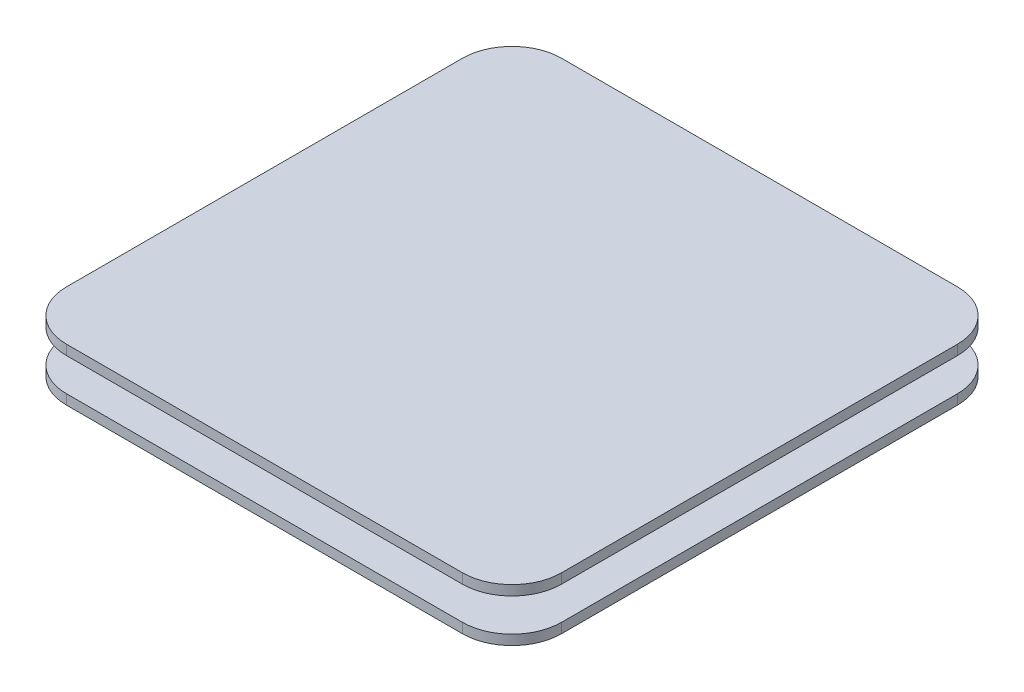
ISO-10303-21;
HEADER;
FILE_DESCRIPTION(('STEP AP214'),'2;1');
FILE_NAME('part.step','',(''),(''),'','','');
FILE_SCHEMA(('AUTOMOTIVE_DESIGN { 1 0 10303 214 1 1 1 1 }'));
ENDSEC;
DATA;
#1=APPLICATION_CONTEXT('core data for automotive mechanical design processes');
#2=APPLICATION_PROTOCOL_DEFINITION('international standard','automotive_design',2000,#1);
#3=PRODUCT_CONTEXT('',#1,'mechanical');
#4=PRODUCT('Part','Part','',(#3));
#5=PRODUCT_RELATED_PRODUCT_CATEGORY('part','',(#4));
#6=PRODUCT_DEFINITION_FORMATION('','',#4);
#7=PRODUCT_DEFINITION_CONTEXT('part definition',#1,'design');
#8=PRODUCT_DEFINITION('design','',#6,#7);
#9=PRODUCT_DEFINITION_SHAPE('','',#8);
#10=(LENGTH_UNIT() NAMED_UNIT(*) SI_UNIT(.MILLI.,.METRE.));
#11=(NAMED_UNIT(*) PLANE_ANGLE_UNIT() SI_UNIT($,.RADIAN.));
#12=(NAMED_UNIT(*) SI_UNIT($,.STERADIAN.) SOLID_ANGLE_UNIT());
#13=UNCERTAINTY_MEASURE_WITH_UNIT(LENGTH_MEASURE(1.E-05),#10,'distance_accuracy_value','');
#14=(GEOMETRIC_REPRESENTATION_CONTEXT(3) GLOBAL_UNCERTAINTY_ASSIGNED_CONTEXT((#13)) GLOBAL_UNIT_ASSIGNED_CONTEXT((#10,
#11,#12)) REPRESENTATION_CONTEXT('',''));
#15=CARTESIAN_POINT('',(0.,0.,0.));
#16=DIRECTION('',(0.,0.,1.));
#17=DIRECTION('',(1.,0.,0.));
#18=AXIS2_PLACEMENT_3D('',#15,#16,#17);
#19=CARTESIAN_POINT('',(0.,3.,0.));
#20=DIRECTION('',(0.,1.,0.));
#21=DIRECTION('',(0.,0.,-1.));
#22=AXIS2_PLACEMENT_3D('',#19,#20,#21);
#23=PLANE('',#22);
#24=CARTESIAN_POINT('',(60.,3.,60.));
#25=DIRECTION('',(0.,-1.,0.));
#26=DIRECTION('',(0.,0.,1.));
#27=AXIS2_PLACEMENT_3D('',#24,#25,#26);
#28=CIRCLE('',#27,15.);
#29=CARTESIAN_POINT('',(75.,3.,60.));
#30=VERTEX_POINT('',#29);
#31=CARTESIAN_POINT('',(60.,3.,75.));
#32=VERTEX_POINT('',#31);
#33=EDGE_CURVE('E388',#30,#32,#28,.T.);
#34=ORIENTED_EDGE('',*,*,#33,.F.);
#35=DIRECTION('',(0.,0.,-1.));
#36=VECTOR('',#35,1.);
#37=CARTESIAN_POINT('',(75.,3.,60.));
#38=LINE('',#37,#36);
#39=CARTESIAN_POINT('',(75.,3.,-60.));
#40=VERTEX_POINT('',#39);
#41=EDGE_CURVE('E11',#30,#40,#38,.T.);
#42=ORIENTED_EDGE('',*,*,#41,.T.);
#43=CARTESIAN_POINT('',(60.,3.,-60.));
#44=DIRECTION('',(0.,-1.,0.));
#45=DIRECTION('',(1.,0.,0.));
#46=AXIS2_PLACEMENT_3D('',#43,#44,#45);
#47=CIRCLE('',#46,15.);
#48=CARTESIAN_POINT('',(60.,3.,-75.));
#49=VERTEX_POINT('',#48);
#50=EDGE_CURVE('E20',#49,#40,#47,.T.);
#51=ORIENTED_EDGE('',*,*,#50,.F.);
#52=DIRECTION('',(-1.,0.,0.));
#53=VECTOR('',#52,1.);
#54=CARTESIAN_POINT('',(60.,3.,-75.));
#55=LINE('',#54,#53);
#56=CARTESIAN_POINT('',(-60.,3.,-75.));
#57=VERTEX_POINT('',#56);
#58=EDGE_CURVE('E488',#49,#57,#55,.T.);
#59=ORIENTED_EDGE('',*,*,#58,.T.);
#60=CARTESIAN_POINT('',(-60.,3.,-60.));
#61=DIRECTION('',(0.,-1.,0.));
#62=DIRECTION('',(0.,0.,-1.));
#63=AXIS2_PLACEMENT_3D('',#60,#61,#62);
#64=CIRCLE('',#63,15.);
#65=CARTESIAN_POINT('',(-75.,3.,-60.));
#66=VERTEX_POINT('',#65);
#67=EDGE_CURVE('E477',#66,#57,#64,.T.);
#68=ORIENTED_EDGE('',*,*,#67,.F.);
#69=DIRECTION('',(0.,0.,1.));
#70=VECTOR('',#69,1.);
#71=CARTESIAN_POINT('',(-75.,3.,-60.));
#72=LINE('',#71,#70);
#73=CARTESIAN_POINT('',(-75.,3.,60.));
#74=VERTEX_POINT('',#73);
#75=EDGE_CURVE('E415',#66,#74,#72,.T.);
#76=ORIENTED_EDGE('',*,*,#75,.T.);
#77=CARTESIAN_POINT('',(-60.,3.,60.));
#78=DIRECTION('',(0.,-1.,0.));
#79=DIRECTION('',(-1.,0.,0.));
#80=AXIS2_PLACEMENT_3D('',#77,#78,#79);
#81=CIRCLE('',#80,15.);
#82=CARTESIAN_POINT('',(-60.,3.,75.));
#83=VERTEX_POINT('',#82);
#84=EDGE_CURVE('E286',#83,#74,#81,.T.);
#85=ORIENTED_EDGE('',*,*,#84,.F.);
#86=DIRECTION('',(1.,0.,0.));
#87=VECTOR('',#86,1.);
#88=CARTESIAN_POINT('',(-60.,3.,75.));
#89=LINE('',#88,#87);
#90=EDGE_CURVE('E390',#83,#32,#89,.T.);
#91=ORIENTED_EDGE('',*,*,#90,.T.);
#92=EDGE_LOOP('',(#34,#42,#51,#59,#68,#76,#85,#91));
#93=FACE_BOUND('',#92,.T.);
#94=ADVANCED_FACE('F17',(#93),#23,.T.);
#95=CARTESIAN_POINT('',(0.,-13.,0.));
#96=DIRECTION('',(0.,-1.,0.));
#97=DIRECTION('',(0.,0.,-1.));
#98=AXIS2_PLACEMENT_3D('',#95,#96,#97);
#99=PLANE('',#98);
#100=CARTESIAN_POINT('',(-60.,-13.,60.));
#101=DIRECTION('',(0.,-1.,0.));
#102=DIRECTION('',(0.,0.,1.));
#103=AXIS2_PLACEMENT_3D('',#100,#101,#102);
#104=CIRCLE('',#103,15.);
#105=CARTESIAN_POINT('',(-60.,-13.,75.));
#106=VERTEX_POINT('',#105);
#107=CARTESIAN_POINT('',(-75.,-13.,60.));
#108=VERTEX_POINT('',#107);
#109=EDGE_CURVE('E453',#106,#108,#104,.T.);
#110=ORIENTED_EDGE('',*,*,#109,.T.);
#111=DIRECTION('',(0.,0.,-1.));
#112=VECTOR('',#111,1.);
#113=CARTESIAN_POINT('',(-75.,-13.,60.));
#114=LINE('',#113,#112);
#115=CARTESIAN_POINT('',(-75.,-13.,-60.));
#116=VERTEX_POINT('',#115);
#117=EDGE_CURVE('E312',#108,#116,#114,.T.);
#118=ORIENTED_EDGE('',*,*,#117,.T.);
#119=CARTESIAN_POINT('',(-60.,-13.,-60.));
#120=DIRECTION('',(0.,-1.,0.));
#121=DIRECTION('',(-1.,0.,0.));
#122=AXIS2_PLACEMENT_3D('',#119,#120,#121);
#123=CIRCLE('',#122,15.);
#124=CARTESIAN_POINT('',(-60.,-13.,-75.));
#125=VERTEX_POINT('',#124);
#126=EDGE_CURVE('E444',#116,#125,#123,.T.);
#127=ORIENTED_EDGE('',*,*,#126,.T.);
#128=DIRECTION('',(1.,0.,0.));
#129=VECTOR('',#128,1.);
#130=CARTESIAN_POINT('',(-60.,-13.,-75.));
#131=LINE('',#130,#129);
#132=CARTESIAN_POINT('',(60.,-13.,-75.));
#133=VERTEX_POINT('',#132);
#134=EDGE_CURVE('E326',#125,#133,#131,.T.);
#135=ORIENTED_EDGE('',*,*,#134,.T.);
#136=CARTESIAN_POINT('',(60.,-13.,-60.));
#137=DIRECTION('',(0.,-1.,0.));
#138=DIRECTION('',(0.,0.,-1.));
#139=AXIS2_PLACEMENT_3D('',#136,#137,#138);
#140=CIRCLE('',#139,15.);
#141=CARTESIAN_POINT('',(75.,-13.,-60.));
#142=VERTEX_POINT('',#141);
#143=EDGE_CURVE('E434',#133,#142,#140,.T.);
#144=ORIENTED_EDGE('',*,*,#143,.T.);
#145=DIRECTION('',(0.,0.,1.));
#146=VECTOR('',#145,1.);
#147=CARTESIAN_POINT('',(75.,-13.,-60.));
#148=LINE('',#147,#146);
#149=CARTESIAN_POINT('',(75.,-13.,60.));
#150=VERTEX_POINT('',#149);
#151=EDGE_CURVE('E340',#142,#150,#148,.T.);
#152=ORIENTED_EDGE('',*,*,#151,.T.);
#153=CARTESIAN_POINT('',(60.,-13.,60.));
#154=DIRECTION('',(0.,-1.,0.));
#155=DIRECTION('',(1.,0.,0.));
#156=AXIS2_PLACEMENT_3D('',#153,#154,#155);
#157=CIRCLE('',#156,15.);
#158=CARTESIAN_POINT('',(60.,-13.,75.));
#159=VERTEX_POINT('',#158);
#160=EDGE_CURVE('E341',#150,#159,#157,.T.);
#161=ORIENTED_EDGE('',*,*,#160,.T.);
#162=DIRECTION('',(-1.,0.,0.));
#163=VECTOR('',#162,1.);
#164=CARTESIAN_POINT('',(60.,-13.,75.));
#165=LINE('',#164,#163);
#166=EDGE_CURVE('E353',#159,#106,#165,.T.);
#167=ORIENTED_EDGE('',*,*,#166,.T.);
#168=EDGE_LOOP('',(#110,#118,#127,#135,#144,#152,#161,#167));
#169=FACE_BOUND('',#168,.T.);
#170=ADVANCED_FACE('F683',(#169),#99,.T.);
#171=CARTESIAN_POINT('',(75.,0.,75.));
#172=DIRECTION('',(1.,0.,0.));
#173=DIRECTION('',(0.,1.,0.));
#174=AXIS2_PLACEMENT_3D('',#171,#172,#173);
#175=PLANE('',#174);
#176=DIRECTION('',(0.,1.,0.));
#177=VECTOR('',#176,1.);
#178=CARTESIAN_POINT('',(75.,0.,60.));
#179=LINE('',#178,#177);
#180=CARTESIAN_POINT('',(75.,0.,60.));
#181=VERTEX_POINT('',#180);
#182=EDGE_CURVE('E459',#181,#30,#179,.T.);
#183=ORIENTED_EDGE('',*,*,#182,.F.);
#184=DIRECTION('',(0.,0.,-1.));
#185=VECTOR('',#184,1.);
#186=CARTESIAN_POINT('',(75.,0.,60.));
#187=LINE('',#186,#185);
#188=CARTESIAN_POINT('',(75.,0.,-60.));
#189=VERTEX_POINT('',#188);
#190=EDGE_CURVE('E418',#181,#189,#187,.T.);
#191=ORIENTED_EDGE('',*,*,#190,.T.);
#192=DIRECTION('',(0.,1.,0.));
#193=VECTOR('',#192,1.);
#194=CARTESIAN_POINT('',(75.,0.,-60.));
#195=LINE('',#194,#193);
#196=EDGE_CURVE('E489',#189,#40,#195,.T.);
#197=ORIENTED_EDGE('',*,*,#196,.T.);
#198=ORIENTED_EDGE('',*,*,#41,.F.);
#199=EDGE_LOOP('',(#183,#191,#197,#198));
#200=FACE_BOUND('',#199,.T.);
#201=ADVANCED_FACE('F523',(#200),#175,.T.);
#202=CARTESIAN_POINT('',(60.,-21.,-60.));
#203=DIRECTION('',(0.,-1.,0.));
#204=DIRECTION('',(0.,0.,-1.));
#205=AXIS2_PLACEMENT_3D('',#202,#203,#204);
#206=CYLINDRICAL_SURFACE('',#205,15.);
#207=ORIENTED_EDGE('',*,*,#196,.F.);
#208=CARTESIAN_POINT('',(60.,0.,-60.));
#209=DIRECTION('',(0.,1.,0.));
#210=DIRECTION('',(0.,0.,-1.));
#211=AXIS2_PLACEMENT_3D('',#208,#209,#210);
#212=CIRCLE('',#211,15.);
#213=CARTESIAN_POINT('',(60.,0.,-75.));
#214=VERTEX_POINT('',#213);
#215=EDGE_CURVE('E407',#189,#214,#212,.T.);
#216=ORIENTED_EDGE('',*,*,#215,.T.);
#217=DIRECTION('',(0.,1.,0.));
#218=VECTOR('',#217,1.);
#219=CARTESIAN_POINT('',(60.,0.,-75.));
#220=LINE('',#219,#218);
#221=EDGE_CURVE('E482',#214,#49,#220,.T.);
#222=ORIENTED_EDGE('',*,*,#221,.T.);
#223=ORIENTED_EDGE('',*,*,#50,.T.);
#224=EDGE_LOOP('',(#207,#216,#222,#223));
#225=FACE_BOUND('',#224,.T.);
#226=ADVANCED_FACE('F498',(#225),#206,.T.);
#227=CARTESIAN_POINT('',(75.,0.,-75.));
#228=DIRECTION('',(0.,0.,-1.));
#229=DIRECTION('',(0.,-1.,0.));
#230=AXIS2_PLACEMENT_3D('',#227,#228,#229);
#231=PLANE('',#230);
#232=ORIENTED_EDGE('',*,*,#221,.F.);
#233=DIRECTION('',(-1.,0.,0.));
#234=VECTOR('',#233,1.);
#235=CARTESIAN_POINT('',(60.,0.,-75.));
#236=LINE('',#235,#234);
#237=CARTESIAN_POINT('',(-60.,0.,-75.));
#238=VERTEX_POINT('',#237);
#239=EDGE_CURVE('E402',#214,#238,#236,.T.);
#240=ORIENTED_EDGE('',*,*,#239,.T.);
#241=DIRECTION('',(0.,1.,0.));
#242=VECTOR('',#241,1.);
#243=CARTESIAN_POINT('',(-60.,0.,-75.));
#244=LINE('',#243,#242);
#245=EDGE_CURVE('E478',#238,#57,#244,.T.);
#246=ORIENTED_EDGE('',*,*,#245,.T.);
#247=ORIENTED_EDGE('',*,*,#58,.F.);
#248=EDGE_LOOP('',(#232,#240,#246,#247));
#249=FACE_BOUND('',#248,.T.);
#250=ADVANCED_FACE('F503',(#249),#231,.T.);
#251=CARTESIAN_POINT('',(-60.,-21.,-60.));
#252=DIRECTION('',(0.,-1.,0.));
#253=DIRECTION('',(-1.,0.,0.));
#254=AXIS2_PLACEMENT_3D('',#251,#252,#253);
#255=CYLINDRICAL_SURFACE('',#254,15.);
#256=ORIENTED_EDGE('',*,*,#245,.F.);
#257=CARTESIAN_POINT('',(-60.,0.,-60.));
#258=DIRECTION('',(0.,1.,0.));
#259=DIRECTION('',(-1.,0.,0.));
#260=AXIS2_PLACEMENT_3D('',#257,#258,#259);
#261=CIRCLE('',#260,15.);
#262=CARTESIAN_POINT('',(-75.,0.,-60.));
#263=VERTEX_POINT('',#262);
#264=EDGE_CURVE('E403',#238,#263,#261,.T.);
#265=ORIENTED_EDGE('',*,*,#264,.T.);
#266=DIRECTION('',(0.,1.,0.));
#267=VECTOR('',#266,1.);
#268=CARTESIAN_POINT('',(-75.,0.,-60.));
#269=LINE('',#268,#267);
#270=EDGE_CURVE('E472',#263,#66,#269,.T.);
#271=ORIENTED_EDGE('',*,*,#270,.T.);
#272=ORIENTED_EDGE('',*,*,#67,.T.);
#273=EDGE_LOOP('',(#256,#265,#271,#272));
#274=FACE_BOUND('',#273,.T.);
#275=ADVANCED_FACE('F510',(#274),#255,.T.);
#276=CARTESIAN_POINT('',(-75.,0.,-75.));
#277=DIRECTION('',(-1.,0.,0.));
#278=DIRECTION('',(0.,0.,1.));
#279=AXIS2_PLACEMENT_3D('',#276,#277,#278);
#280=PLANE('',#279);
#281=DIRECTION('',(0.,1.,0.));
#282=VECTOR('',#281,1.);
#283=CARTESIAN_POINT('',(-75.,0.,60.));
#284=LINE('',#283,#282);
#285=CARTESIAN_POINT('',(-75.,0.,60.));
#286=VERTEX_POINT('',#285);
#287=EDGE_CURVE('E282',#286,#74,#284,.T.);
#288=ORIENTED_EDGE('',*,*,#287,.T.);
#289=ORIENTED_EDGE('',*,*,#75,.F.);
#290=ORIENTED_EDGE('',*,*,#270,.F.);
#291=DIRECTION('',(0.,0.,1.));
#292=VECTOR('',#291,1.);
#293=CARTESIAN_POINT('',(-75.,0.,-60.));
#294=LINE('',#293,#292);
#295=EDGE_CURVE('E397',#263,#286,#294,.T.);
#296=ORIENTED_EDGE('',*,*,#295,.T.);
#297=EDGE_LOOP('',(#288,#289,#290,#296));
#298=FACE_BOUND('',#297,.T.);
#299=ADVANCED_FACE('F511',(#298),#280,.T.);
#300=CARTESIAN_POINT('',(-60.,-21.,60.));
#301=DIRECTION('',(0.,-1.,0.));
#302=DIRECTION('',(0.,0.,1.));
#303=AXIS2_PLACEMENT_3D('',#300,#301,#302);
#304=CYLINDRICAL_SURFACE('',#303,15.);
#305=ORIENTED_EDGE('',*,*,#287,.F.);
#306=CARTESIAN_POINT('',(-60.,0.,60.));
#307=DIRECTION('',(0.,1.,0.));
#308=DIRECTION('',(0.,0.,1.));
#309=AXIS2_PLACEMENT_3D('',#306,#307,#308);
#310=CIRCLE('',#309,15.);
#311=CARTESIAN_POINT('',(-60.,0.,75.));
#312=VERTEX_POINT('',#311);
#313=EDGE_CURVE('E395',#286,#312,#310,.T.);
#314=ORIENTED_EDGE('',*,*,#313,.T.);
#315=DIRECTION('',(0.,1.,0.));
#316=VECTOR('',#315,1.);
#317=CARTESIAN_POINT('',(-60.,0.,75.));
#318=LINE('',#317,#316);
#319=EDGE_CURVE('E290',#312,#83,#318,.T.);
#320=ORIENTED_EDGE('',*,*,#319,.T.);
#321=ORIENTED_EDGE('',*,*,#84,.T.);
#322=EDGE_LOOP('',(#305,#314,#320,#321));
#323=FACE_BOUND('',#322,.T.);
#324=ADVANCED_FACE('F512',(#323),#304,.T.);
#325=CARTESIAN_POINT('',(-75.,0.,75.));
#326=DIRECTION('',(0.,0.,1.));
#327=DIRECTION('',(1.,0.,0.));
#328=AXIS2_PLACEMENT_3D('',#325,#326,#327);
#329=PLANE('',#328);
#330=DIRECTION('',(0.,1.,0.));
#331=VECTOR('',#330,1.);
#332=CARTESIAN_POINT('',(60.,0.,75.));
#333=LINE('',#332,#331);
#334=CARTESIAN_POINT('',(60.,0.,75.));
#335=VERTEX_POINT('',#334);
#336=EDGE_CURVE('E460',#335,#32,#333,.T.);
#337=ORIENTED_EDGE('',*,*,#336,.T.);
#338=ORIENTED_EDGE('',*,*,#90,.F.);
#339=ORIENTED_EDGE('',*,*,#319,.F.);
#340=DIRECTION('',(1.,0.,0.));
#341=VECTOR('',#340,1.);
#342=CARTESIAN_POINT('',(-60.,0.,75.));
#343=LINE('',#342,#341);
#344=EDGE_CURVE('E393',#312,#335,#343,.T.);
#345=ORIENTED_EDGE('',*,*,#344,.T.);
#346=EDGE_LOOP('',(#337,#338,#339,#345));
#347=FACE_BOUND('',#346,.T.);
#348=ADVANCED_FACE('F519',(#347),#329,.T.);
#349=CARTESIAN_POINT('',(60.,-21.,60.));
#350=DIRECTION('',(0.,-1.,0.));
#351=DIRECTION('',(1.,0.,0.));
#352=AXIS2_PLACEMENT_3D('',#349,#350,#351);
#353=CYLINDRICAL_SURFACE('',#352,15.);
#354=ORIENTED_EDGE('',*,*,#336,.F.);
#355=CARTESIAN_POINT('',(60.,0.,60.));
#356=DIRECTION('',(0.,1.,0.));
#357=DIRECTION('',(1.,0.,0.));
#358=AXIS2_PLACEMENT_3D('',#355,#356,#357);
#359=CIRCLE('',#358,15.);
#360=EDGE_CURVE('E387',#335,#181,#359,.T.);
#361=ORIENTED_EDGE('',*,*,#360,.T.);
#362=ORIENTED_EDGE('',*,*,#182,.T.);
#363=ORIENTED_EDGE('',*,*,#33,.T.);
#364=EDGE_LOOP('',(#354,#361,#362,#363));
#365=FACE_BOUND('',#364,.T.);
#366=ADVANCED_FACE('F525',(#365),#353,.T.);
#367=CARTESIAN_POINT('',(-60.,-10.,60.));
#368=DIRECTION('',(0.,-1.,0.));
#369=DIRECTION('',(0.,0.,1.));
#370=AXIS2_PLACEMENT_3D('',#367,#368,#369);
#371=CYLINDRICAL_SURFACE('',#370,15.);
#372=CARTESIAN_POINT('',(-60.,-10.,60.));
#373=DIRECTION('',(0.,-1.,0.));
#374=DIRECTION('',(0.,0.,1.));
#375=AXIS2_PLACEMENT_3D('',#372,#373,#374);
#376=CIRCLE('',#375,15.);
#377=CARTESIAN_POINT('',(-60.,-10.,75.));
#378=VERTEX_POINT('',#377);
#379=CARTESIAN_POINT('',(-75.,-10.,60.));
#380=VERTEX_POINT('',#379);
#381=EDGE_CURVE('E385',#378,#380,#376,.T.);
#382=ORIENTED_EDGE('',*,*,#381,.T.);
#383=DIRECTION('',(0.,-1.,0.));
#384=VECTOR('',#383,1.);
#385=CARTESIAN_POINT('',(-75.,-10.,60.));
#386=LINE('',#385,#384);
#387=EDGE_CURVE('E318',#380,#108,#386,.T.);
#388=ORIENTED_EDGE('',*,*,#387,.T.);
#389=ORIENTED_EDGE('',*,*,#109,.F.);
#390=DIRECTION('',(0.,-1.,0.));
#391=VECTOR('',#390,1.);
#392=CARTESIAN_POINT('',(-60.,-10.,75.));
#393=LINE('',#392,#391);
#394=EDGE_CURVE('E419',#378,#106,#393,.T.);
#395=ORIENTED_EDGE('',*,*,#394,.F.);
#396=EDGE_LOOP('',(#382,#388,#389,#395));
#397=FACE_BOUND('',#396,.T.);
#398=ADVANCED_FACE('F707',(#397),#371,.T.);
#399=CARTESIAN_POINT('',(-75.,-10.,60.));
#400=DIRECTION('',(-1.,0.,0.));
#401=DIRECTION('',(0.,0.,1.));
#402=AXIS2_PLACEMENT_3D('',#399,#400,#401);
#403=PLANE('',#402);
#404=DIRECTION('',(0.,0.,-1.));
#405=VECTOR('',#404,1.);
#406=CARTESIAN_POINT('',(-75.,-10.,60.));
#407=LINE('',#406,#405);
#408=CARTESIAN_POINT('',(-75.,-10.,-60.));
#409=VERTEX_POINT('',#408);
#410=EDGE_CURVE('E378',#380,#409,#407,.T.);
#411=ORIENTED_EDGE('',*,*,#410,.T.);
#412=DIRECTION('',(0.,-1.,0.));
#413=VECTOR('',#412,1.);
#414=CARTESIAN_POINT('',(-75.,-10.,-60.));
#415=LINE('',#414,#413);
#416=EDGE_CURVE('E317',#409,#116,#415,.T.);
#417=ORIENTED_EDGE('',*,*,#416,.T.);
#418=ORIENTED_EDGE('',*,*,#117,.F.);
#419=ORIENTED_EDGE('',*,*,#387,.F.);
#420=EDGE_LOOP('',(#411,#417,#418,#419));
#421=FACE_BOUND('',#420,.T.);
#422=ADVANCED_FACE('F715',(#421),#403,.T.);
#423=CARTESIAN_POINT('',(-60.,-10.,-60.));
#424=DIRECTION('',(0.,-1.,0.));
#425=DIRECTION('',(-1.,0.,0.));
#426=AXIS2_PLACEMENT_3D('',#423,#424,#425);
#427=CYLINDRICAL_SURFACE('',#426,15.);
#428=CARTESIAN_POINT('',(-60.,-10.,-60.));
#429=DIRECTION('',(0.,-1.,0.));
#430=DIRECTION('',(-1.,0.,0.));
#431=AXIS2_PLACEMENT_3D('',#428,#429,#430);
#432=CIRCLE('',#431,15.);
#433=CARTESIAN_POINT('',(-60.,-10.,-75.));
#434=VERTEX_POINT('',#433);
#435=EDGE_CURVE('E296',#409,#434,#432,.T.);
#436=ORIENTED_EDGE('',*,*,#435,.T.);
#437=DIRECTION('',(0.,-1.,0.));
#438=VECTOR('',#437,1.);
#439=CARTESIAN_POINT('',(-60.,-10.,-75.));
#440=LINE('',#439,#438);
#441=EDGE_CURVE('E328',#434,#125,#440,.T.);
#442=ORIENTED_EDGE('',*,*,#441,.T.);
#443=ORIENTED_EDGE('',*,*,#126,.F.);
#444=ORIENTED_EDGE('',*,*,#416,.F.);
#445=EDGE_LOOP('',(#436,#442,#443,#444));
#446=FACE_BOUND('',#445,.T.);
#447=ADVANCED_FACE('F717',(#446),#427,.T.);
#448=CARTESIAN_POINT('',(-60.,-10.,-75.));
#449=DIRECTION('',(0.,0.,-1.));
#450=DIRECTION('',(0.,-1.,0.));
#451=AXIS2_PLACEMENT_3D('',#448,#449,#450);
#452=PLANE('',#451);
#453=DIRECTION('',(1.,0.,0.));
#454=VECTOR('',#453,1.);
#455=CARTESIAN_POINT('',(-60.,-10.,-75.));
#456=LINE('',#455,#454);
#457=CARTESIAN_POINT('',(60.,-10.,-75.));
#458=VERTEX_POINT('',#457);
#459=EDGE_CURVE('E291',#434,#458,#456,.T.);
#460=ORIENTED_EDGE('',*,*,#459,.T.);
#461=DIRECTION('',(0.,-1.,0.));
#462=VECTOR('',#461,1.);
#463=CARTESIAN_POINT('',(60.,-10.,-75.));
#464=LINE('',#463,#462);
#465=EDGE_CURVE('E329',#458,#133,#464,.T.);
#466=ORIENTED_EDGE('',*,*,#465,.T.);
#467=ORIENTED_EDGE('',*,*,#134,.F.);
#468=ORIENTED_EDGE('',*,*,#441,.F.);
#469=EDGE_LOOP('',(#460,#466,#467,#468));
#470=FACE_BOUND('',#469,.T.);
#471=ADVANCED_FACE('F724',(#470),#452,.T.);
#472=CARTESIAN_POINT('',(60.,-10.,-60.));
#473=DIRECTION('',(0.,-1.,0.));
#474=DIRECTION('',(0.,0.,-1.));
#475=AXIS2_PLACEMENT_3D('',#472,#473,#474);
#476=CYLINDRICAL_SURFACE('',#475,15.);
#477=CARTESIAN_POINT('',(60.,-10.,-60.));
#478=DIRECTION('',(0.,-1.,0.));
#479=DIRECTION('',(0.,0.,-1.));
#480=AXIS2_PLACEMENT_3D('',#477,#478,#479);
#481=CIRCLE('',#480,15.);
#482=CARTESIAN_POINT('',(75.,-10.,-60.));
#483=VERTEX_POINT('',#482);
#484=EDGE_CURVE('E300',#458,#483,#481,.T.);
#485=ORIENTED_EDGE('',*,*,#484,.T.);
#486=DIRECTION('',(0.,-1.,0.));
#487=VECTOR('',#486,1.);
#488=CARTESIAN_POINT('',(75.,-10.,-60.));
#489=LINE('',#488,#487);
#490=EDGE_CURVE('E431',#483,#142,#489,.T.);
#491=ORIENTED_EDGE('',*,*,#490,.T.);
#492=ORIENTED_EDGE('',*,*,#143,.F.);
#493=ORIENTED_EDGE('',*,*,#465,.F.);
#494=EDGE_LOOP('',(#485,#491,#492,#493));
#495=FACE_BOUND('',#494,.T.);
#496=ADVANCED_FACE('F721',(#495),#476,.T.);
#497=CARTESIAN_POINT('',(75.,-10.,-60.));
#498=DIRECTION('',(1.,0.,0.));
#499=DIRECTION('',(0.,1.,0.));
#500=AXIS2_PLACEMENT_3D('',#497,#498,#499);
#501=PLANE('',#500);
#502=DIRECTION('',(0.,0.,1.));
#503=VECTOR('',#502,1.);
#504=CARTESIAN_POINT('',(75.,-10.,-60.));
#505=LINE('',#504,#503);
#506=CARTESIAN_POINT('',(75.,-10.,60.));
#507=VERTEX_POINT('',#506);
#508=EDGE_CURVE('E366',#483,#507,#505,.T.);
#509=ORIENTED_EDGE('',*,*,#508,.T.);
#510=DIRECTION('',(0.,-1.,0.));
#511=VECTOR('',#510,1.);
#512=CARTESIAN_POINT('',(75.,-10.,60.));
#513=LINE('',#512,#511);
#514=EDGE_CURVE('E336',#507,#150,#513,.T.);
#515=ORIENTED_EDGE('',*,*,#514,.T.);
#516=ORIENTED_EDGE('',*,*,#151,.F.);
#517=ORIENTED_EDGE('',*,*,#490,.F.);
#518=EDGE_LOOP('',(#509,#515,#516,#517));
#519=FACE_BOUND('',#518,.T.);
#520=ADVANCED_FACE('F719',(#519),#501,.T.);
#521=CARTESIAN_POINT('',(60.,-10.,60.));
#522=DIRECTION('',(0.,-1.,0.));
#523=DIRECTION('',(1.,0.,0.));
#524=AXIS2_PLACEMENT_3D('',#521,#522,#523);
#525=CYLINDRICAL_SURFACE('',#524,15.);
#526=CARTESIAN_POINT('',(60.,-10.,60.));
#527=DIRECTION('',(0.,-1.,0.));
#528=DIRECTION('',(1.,0.,0.));
#529=AXIS2_PLACEMENT_3D('',#526,#527,#528);
#530=CIRCLE('',#529,15.);
#531=CARTESIAN_POINT('',(60.,-10.,75.));
#532=VERTEX_POINT('',#531);
#533=EDGE_CURVE('E365',#507,#532,#530,.T.);
#534=ORIENTED_EDGE('',*,*,#533,.T.);
#535=DIRECTION('',(0.,-1.,0.));
#536=VECTOR('',#535,1.);
#537=CARTESIAN_POINT('',(60.,-10.,75.));
#538=LINE('',#537,#536);
#539=EDGE_CURVE('E349',#532,#159,#538,.T.);
#540=ORIENTED_EDGE('',*,*,#539,.T.);
#541=ORIENTED_EDGE('',*,*,#160,.F.);
#542=ORIENTED_EDGE('',*,*,#514,.F.);
#543=EDGE_LOOP('',(#534,#540,#541,#542));
#544=FACE_BOUND('',#543,.T.);
#545=ADVANCED_FACE('F677',(#544),#525,.T.);
#546=CARTESIAN_POINT('',(60.,-10.,75.));
#547=DIRECTION('',(0.,0.,1.));
#548=DIRECTION('',(1.,0.,0.));
#549=AXIS2_PLACEMENT_3D('',#546,#547,#548);
#550=PLANE('',#549);
#551=DIRECTION('',(-1.,0.,0.));
#552=VECTOR('',#551,1.);
#553=CARTESIAN_POINT('',(60.,-10.,75.));
#554=LINE('',#553,#552);
#555=EDGE_CURVE('E358',#532,#378,#554,.T.);
#556=ORIENTED_EDGE('',*,*,#555,.T.);
#557=ORIENTED_EDGE('',*,*,#394,.T.);
#558=ORIENTED_EDGE('',*,*,#166,.F.);
#559=ORIENTED_EDGE('',*,*,#539,.F.);
#560=EDGE_LOOP('',(#556,#557,#558,#559));
#561=FACE_BOUND('',#560,.T.);
#562=ADVANCED_FACE('F669',(#561),#550,.T.);
#563=CARTESIAN_POINT('',(0.,0.,0.));
#564=DIRECTION('',(0.,1.,0.));
#565=DIRECTION('',(0.,0.,-1.));
#566=AXIS2_PLACEMENT_3D('',#563,#564,#565);
#567=PLANE('',#566);
#568=DIRECTION('',(0.,0.,-1.));
#569=VECTOR('',#568,1.);
#570=CARTESIAN_POINT('',(37.5,0.,-10.));
#571=LINE('',#570,#569);
#572=CARTESIAN_POINT('',(37.5,0.,10.));
#573=VERTEX_POINT('',#572);
#574=CARTESIAN_POINT('',(37.5,0.,-10.));
#575=VERTEX_POINT('',#574);
#576=EDGE_CURVE('E262',#573,#575,#571,.T.);
#577=ORIENTED_EDGE('',*,*,#576,.F.);
#578=DIRECTION('',(-1.,0.,0.));
#579=VECTOR('',#578,1.);
#580=CARTESIAN_POINT('',(37.5,0.,10.));
#581=LINE('',#580,#579);
#582=CARTESIAN_POINT('',(57.5,0.,10.));
#583=VERTEX_POINT('',#582);
#584=EDGE_CURVE('E360',#583,#573,#581,.T.);
#585=ORIENTED_EDGE('',*,*,#584,.F.);
#586=DIRECTION('',(0.,0.,1.));
#587=VECTOR('',#586,1.);
#588=CARTESIAN_POINT('',(57.5,0.,10.));
#589=LINE('',#588,#587);
#590=CARTESIAN_POINT('',(57.5,0.,-10.));
#591=VERTEX_POINT('',#590);
#592=EDGE_CURVE('E239',#591,#583,#589,.T.);
#593=ORIENTED_EDGE('',*,*,#592,.F.);
#594=DIRECTION('',(1.,0.,0.));
#595=VECTOR('',#594,1.);
#596=CARTESIAN_POINT('',(57.5,0.,-10.));
#597=LINE('',#596,#595);
#598=EDGE_CURVE('E250',#575,#591,#597,.T.);
#599=ORIENTED_EDGE('',*,*,#598,.F.);
#600=EDGE_LOOP('',(#577,#585,#593,#599));
#601=FACE_BOUND('',#600,.T.);
#602=DIRECTION('',(0.,0.,-1.));
#603=VECTOR('',#602,1.);
#604=CARTESIAN_POINT('',(-57.5,0.,-10.));
#605=LINE('',#604,#603);
#606=CARTESIAN_POINT('',(-57.5,0.,10.));
#607=VERTEX_POINT('',#606);
#608=CARTESIAN_POINT('',(-57.5,0.,-10.));
#609=VERTEX_POINT('',#608);
#610=EDGE_CURVE('E269',#607,#609,#605,.T.);
#611=ORIENTED_EDGE('',*,*,#610,.F.);
#612=DIRECTION('',(-1.,0.,0.));
#613=VECTOR('',#612,1.);
#614=CARTESIAN_POINT('',(-57.5,0.,10.));
#615=LINE('',#614,#613);
#616=CARTESIAN_POINT('',(-37.5,0.,10.));
#617=VERTEX_POINT('',#616);
#618=EDGE_CURVE('E279',#617,#607,#615,.T.);
#619=ORIENTED_EDGE('',*,*,#618,.F.);
#620=DIRECTION('',(0.,0.,1.));
#621=VECTOR('',#620,1.);
#622=CARTESIAN_POINT('',(-37.5,0.,10.));
#623=LINE('',#622,#621);
#624=CARTESIAN_POINT('',(-37.5,0.,-10.));
#625=VERTEX_POINT('',#624);
#626=EDGE_CURVE('E308',#625,#617,#623,.T.);
#627=ORIENTED_EDGE('',*,*,#626,.F.);
#628=DIRECTION('',(1.,0.,0.));
#629=VECTOR('',#628,1.);
#630=CARTESIAN_POINT('',(-37.5,0.,-10.));
#631=LINE('',#630,#629);
#632=EDGE_CURVE('E302',#609,#625,#631,.T.);
#633=ORIENTED_EDGE('',*,*,#632,.F.);
#634=EDGE_LOOP('',(#611,#619,#627,#633));
#635=FACE_BOUND('',#634,.T.);
#636=ORIENTED_EDGE('',*,*,#360,.F.);
#637=ORIENTED_EDGE('',*,*,#344,.F.);
#638=ORIENTED_EDGE('',*,*,#313,.F.);
#639=ORIENTED_EDGE('',*,*,#295,.F.);
#640=ORIENTED_EDGE('',*,*,#264,.F.);
#641=ORIENTED_EDGE('',*,*,#239,.F.);
#642=ORIENTED_EDGE('',*,*,#215,.F.);
#643=ORIENTED_EDGE('',*,*,#190,.F.);
#644=EDGE_LOOP('',(#636,#637,#638,#639,#640,#641,#642,#643));
#645=FACE_BOUND('',#644,.T.);
#646=ADVANCED_FACE('F527',(#601,#635,#645),#567,.F.);
#647=CARTESIAN_POINT('',(0.,-10.,0.));
#648=DIRECTION('',(0.,-1.,0.));
#649=DIRECTION('',(0.,0.,-1.));
#650=AXIS2_PLACEMENT_3D('',#647,#648,#649);
#651=PLANE('',#650);
#652=DIRECTION('',(-1.,0.,0.));
#653=VECTOR('',#652,1.);
#654=CARTESIAN_POINT('',(-57.5,-10.,10.));
#655=LINE('',#654,#653);
#656=CARTESIAN_POINT('',(-37.5,-10.,10.));
#657=VERTEX_POINT('',#656);
#658=CARTESIAN_POINT('',(-57.5,-10.,10.));
#659=VERTEX_POINT('',#658);
#660=EDGE_CURVE('E281',#657,#659,#655,.T.);
#661=ORIENTED_EDGE('',*,*,#660,.T.);
#662=DIRECTION('',(0.,0.,-1.));
#663=VECTOR('',#662,1.);
#664=CARTESIAN_POINT('',(-57.5,-10.,-10.));
#665=LINE('',#664,#663);
#666=CARTESIAN_POINT('',(-57.5,-10.,-10.));
#667=VERTEX_POINT('',#666);
#668=EDGE_CURVE('E531',#659,#667,#665,.T.);
#669=ORIENTED_EDGE('',*,*,#668,.T.);
#670=DIRECTION('',(1.,0.,0.));
#671=VECTOR('',#670,1.);
#672=CARTESIAN_POINT('',(-37.5,-10.,-10.));
#673=LINE('',#672,#671);
#674=CARTESIAN_POINT('',(-37.5,-10.,-10.));
#675=VERTEX_POINT('',#674);
#676=EDGE_CURVE('E295',#667,#675,#673,.T.);
#677=ORIENTED_EDGE('',*,*,#676,.T.);
#678=DIRECTION('',(0.,0.,1.));
#679=VECTOR('',#678,1.);
#680=CARTESIAN_POINT('',(-37.5,-10.,10.));
#681=LINE('',#680,#679);
#682=EDGE_CURVE('E314',#675,#657,#681,.T.);
#683=ORIENTED_EDGE('',*,*,#682,.T.);
#684=EDGE_LOOP('',(#661,#669,#677,#683));
#685=FACE_BOUND('',#684,.T.);
#686=DIRECTION('',(-1.,0.,0.));
#687=VECTOR('',#686,1.);
#688=CARTESIAN_POINT('',(37.5,-10.,10.));
#689=LINE('',#688,#687);
#690=CARTESIAN_POINT('',(57.5,-10.,10.));
#691=VERTEX_POINT('',#690);
#692=CARTESIAN_POINT('',(37.5,-10.,10.));
#693=VERTEX_POINT('',#692);
#694=EDGE_CURVE('E347',#691,#693,#689,.T.);
#695=ORIENTED_EDGE('',*,*,#694,.T.);
#696=DIRECTION('',(0.,0.,-1.));
#697=VECTOR('',#696,1.);
#698=CARTESIAN_POINT('',(37.5,-10.,-10.));
#699=LINE('',#698,#697);
#700=CARTESIAN_POINT('',(37.5,-10.,-10.));
#701=VERTEX_POINT('',#700);
#702=EDGE_CURVE('E255',#693,#701,#699,.T.);
#703=ORIENTED_EDGE('',*,*,#702,.T.);
#704=DIRECTION('',(1.,0.,0.));
#705=VECTOR('',#704,1.);
#706=CARTESIAN_POINT('',(57.5,-10.,-10.));
#707=LINE('',#706,#705);
#708=CARTESIAN_POINT('',(57.5,-10.,-10.));
#709=VERTEX_POINT('',#708);
#710=EDGE_CURVE('E244',#701,#709,#707,.T.);
#711=ORIENTED_EDGE('',*,*,#710,.T.);
#712=DIRECTION('',(0.,0.,1.));
#713=VECTOR('',#712,1.);
#714=CARTESIAN_POINT('',(57.5,-10.,10.));
#715=LINE('',#714,#713);
#716=EDGE_CURVE('E228',#709,#691,#715,.T.);
#717=ORIENTED_EDGE('',*,*,#716,.T.);
#718=EDGE_LOOP('',(#695,#703,#711,#717));
#719=FACE_BOUND('',#718,.T.);
#720=ORIENTED_EDGE('',*,*,#555,.F.);
#721=ORIENTED_EDGE('',*,*,#533,.F.);
#722=ORIENTED_EDGE('',*,*,#508,.F.);
#723=ORIENTED_EDGE('',*,*,#484,.F.);
#724=ORIENTED_EDGE('',*,*,#459,.F.);
#725=ORIENTED_EDGE('',*,*,#435,.F.);
#726=ORIENTED_EDGE('',*,*,#410,.F.);
#727=ORIENTED_EDGE('',*,*,#381,.F.);
#728=EDGE_LOOP('',(#720,#721,#722,#723,#724,#725,#726,#727));
#729=FACE_BOUND('',#728,.T.);
#730=ADVANCED_FACE('F253',(#685,#719,#729),#651,.F.);
#731=CARTESIAN_POINT('',(57.5,0.,10.));
#732=DIRECTION('',(0.,0.,1.));
#733=DIRECTION('',(1.,0.,0.));
#734=AXIS2_PLACEMENT_3D('',#731,#732,#733);
#735=PLANE('',#734);
#736=ORIENTED_EDGE('',*,*,#694,.F.);
#737=DIRECTION('',(0.,-1.,0.));
#738=VECTOR('',#737,1.);
#739=CARTESIAN_POINT('',(57.5,0.,10.));
#740=LINE('',#739,#738);
#741=EDGE_CURVE('E240',#583,#691,#740,.T.);
#742=ORIENTED_EDGE('',*,*,#741,.F.);
#743=ORIENTED_EDGE('',*,*,#584,.T.);
#744=DIRECTION('',(0.,-1.,0.));
#745=VECTOR('',#744,1.);
#746=CARTESIAN_POINT('',(37.5,0.,10.));
#747=LINE('',#746,#745);
#748=EDGE_CURVE('E280',#573,#693,#747,.T.);
#749=ORIENTED_EDGE('',*,*,#748,.T.);
#750=EDGE_LOOP('',(#736,#742,#743,#749));
#751=FACE_BOUND('',#750,.T.);
#752=ADVANCED_FACE('F676',(#751),#735,.T.);
#753=CARTESIAN_POINT('',(57.5,0.,-10.));
#754=DIRECTION('',(1.,0.,0.));
#755=DIRECTION('',(0.,1.,0.));
#756=AXIS2_PLACEMENT_3D('',#753,#754,#755);
#757=PLANE('',#756);
#758=ORIENTED_EDGE('',*,*,#716,.F.);
#759=DIRECTION('',(0.,-1.,0.));
#760=VECTOR('',#759,1.);
#761=CARTESIAN_POINT('',(57.5,0.,-10.));
#762=LINE('',#761,#760);
#763=EDGE_CURVE('E233',#591,#709,#762,.T.);
#764=ORIENTED_EDGE('',*,*,#763,.F.);
#765=ORIENTED_EDGE('',*,*,#592,.T.);
#766=ORIENTED_EDGE('',*,*,#741,.T.);
#767=EDGE_LOOP('',(#758,#764,#765,#766));
#768=FACE_BOUND('',#767,.T.);
#769=ADVANCED_FACE('F231',(#768),#757,.T.);
#770=CARTESIAN_POINT('',(37.5,0.,-10.));
#771=DIRECTION('',(0.,0.,-1.));
#772=DIRECTION('',(-1.,0.,0.));
#773=AXIS2_PLACEMENT_3D('',#770,#771,#772);
#774=PLANE('',#773);
#775=ORIENTED_EDGE('',*,*,#710,.F.);
#776=DIRECTION('',(0.,-1.,0.));
#777=VECTOR('',#776,1.);
#778=CARTESIAN_POINT('',(37.5,0.,-10.));
#779=LINE('',#778,#777);
#780=EDGE_CURVE('E258',#575,#701,#779,.T.);
#781=ORIENTED_EDGE('',*,*,#780,.F.);
#782=ORIENTED_EDGE('',*,*,#598,.T.);
#783=ORIENTED_EDGE('',*,*,#763,.T.);
#784=EDGE_LOOP('',(#775,#781,#782,#783));
#785=FACE_BOUND('',#784,.T.);
#786=ADVANCED_FACE('F242',(#785),#774,.T.);
#787=CARTESIAN_POINT('',(37.5,0.,10.));
#788=DIRECTION('',(-1.,0.,0.));
#789=DIRECTION('',(0.,0.,1.));
#790=AXIS2_PLACEMENT_3D('',#787,#788,#789);
#791=PLANE('',#790);
#792=ORIENTED_EDGE('',*,*,#702,.F.);
#793=ORIENTED_EDGE('',*,*,#748,.F.);
#794=ORIENTED_EDGE('',*,*,#576,.T.);
#795=ORIENTED_EDGE('',*,*,#780,.T.);
#796=EDGE_LOOP('',(#792,#793,#794,#795));
#797=FACE_BOUND('',#796,.T.);
#798=ADVANCED_FACE('F762',(#797),#791,.T.);
#799=CARTESIAN_POINT('',(-37.5,0.,10.));
#800=DIRECTION('',(0.,0.,1.));
#801=DIRECTION('',(0.,-1.,0.));
#802=AXIS2_PLACEMENT_3D('',#799,#800,#801);
#803=PLANE('',#802);
#804=ORIENTED_EDGE('',*,*,#660,.F.);
#805=DIRECTION('',(0.,-1.,0.));
#806=VECTOR('',#805,1.);
#807=CARTESIAN_POINT('',(-37.5,0.,10.));
#808=LINE('',#807,#806);
#809=EDGE_CURVE('E305',#617,#657,#808,.T.);
#810=ORIENTED_EDGE('',*,*,#809,.F.);
#811=ORIENTED_EDGE('',*,*,#618,.T.);
#812=DIRECTION('',(0.,-1.,0.));
#813=VECTOR('',#812,1.);
#814=CARTESIAN_POINT('',(-57.5,0.,10.));
#815=LINE('',#814,#813);
#816=EDGE_CURVE('E268',#607,#659,#815,.T.);
#817=ORIENTED_EDGE('',*,*,#816,.T.);
#818=EDGE_LOOP('',(#804,#810,#811,#817));
#819=FACE_BOUND('',#818,.T.);
#820=ADVANCED_FACE('F663',(#819),#803,.T.);
#821=CARTESIAN_POINT('',(-37.5,0.,-10.));
#822=DIRECTION('',(1.,0.,0.));
#823=DIRECTION('',(0.,1.,0.));
#824=AXIS2_PLACEMENT_3D('',#821,#822,#823);
#825=PLANE('',#824);
#826=ORIENTED_EDGE('',*,*,#682,.F.);
#827=DIRECTION('',(0.,-1.,0.));
#828=VECTOR('',#827,1.);
#829=CARTESIAN_POINT('',(-37.5,0.,-10.));
#830=LINE('',#829,#828);
#831=EDGE_CURVE('E309',#625,#675,#830,.T.);
#832=ORIENTED_EDGE('',*,*,#831,.F.);
#833=ORIENTED_EDGE('',*,*,#626,.T.);
#834=ORIENTED_EDGE('',*,*,#809,.T.);
#835=EDGE_LOOP('',(#826,#832,#833,#834));
#836=FACE_BOUND('',#835,.T.);
#837=ADVANCED_FACE('F665',(#836),#825,.T.);
#838=CARTESIAN_POINT('',(-57.5,0.,-10.));
#839=DIRECTION('',(0.,0.,-1.));
#840=DIRECTION('',(-1.,0.,0.));
#841=AXIS2_PLACEMENT_3D('',#838,#839,#840);
#842=PLANE('',#841);
#843=ORIENTED_EDGE('',*,*,#676,.F.);
#844=DIRECTION('',(0.,-1.,0.));
#845=VECTOR('',#844,1.);
#846=CARTESIAN_POINT('',(-57.5,0.,-10.));
#847=LINE('',#846,#845);
#848=EDGE_CURVE('E273',#609,#667,#847,.T.);
#849=ORIENTED_EDGE('',*,*,#848,.F.);
#850=ORIENTED_EDGE('',*,*,#632,.T.);
#851=ORIENTED_EDGE('',*,*,#831,.T.);
#852=EDGE_LOOP('',(#843,#849,#850,#851));
#853=FACE_BOUND('',#852,.T.);
#854=ADVANCED_FACE('F658',(#853),#842,.T.);
#855=CARTESIAN_POINT('',(-57.5,0.,10.));
#856=DIRECTION('',(-1.,0.,0.));
#857=DIRECTION('',(0.,0.,1.));
#858=AXIS2_PLACEMENT_3D('',#855,#856,#857);
#859=PLANE('',#858);
#860=ORIENTED_EDGE('',*,*,#668,.F.);
#861=ORIENTED_EDGE('',*,*,#816,.F.);
#862=ORIENTED_EDGE('',*,*,#610,.T.);
#863=ORIENTED_EDGE('',*,*,#848,.T.);
#864=EDGE_LOOP('',(#860,#861,#862,#863));
#865=FACE_BOUND('',#864,.T.);
#866=ADVANCED_FACE('F654',(#865),#859,.T.);
#867=CLOSED_SHELL('',(#94,#170,#201,#226,#250,#275,#299,#324,#348,#366,#398,#422,#447,#471,#496,
#520,#545,#562,#646,#730,#752,#769,#786,#798,#820,#837,#854,#866));
#868=MANIFOLD_SOLID_BREP('B1',#867);
#869=ADVANCED_BREP_SHAPE_REPRESENTATION('',(#18,#868),#14);
#870=SHAPE_DEFINITION_REPRESENTATION(#9,#869);
ENDSEC;
END-ISO-10303-21;
